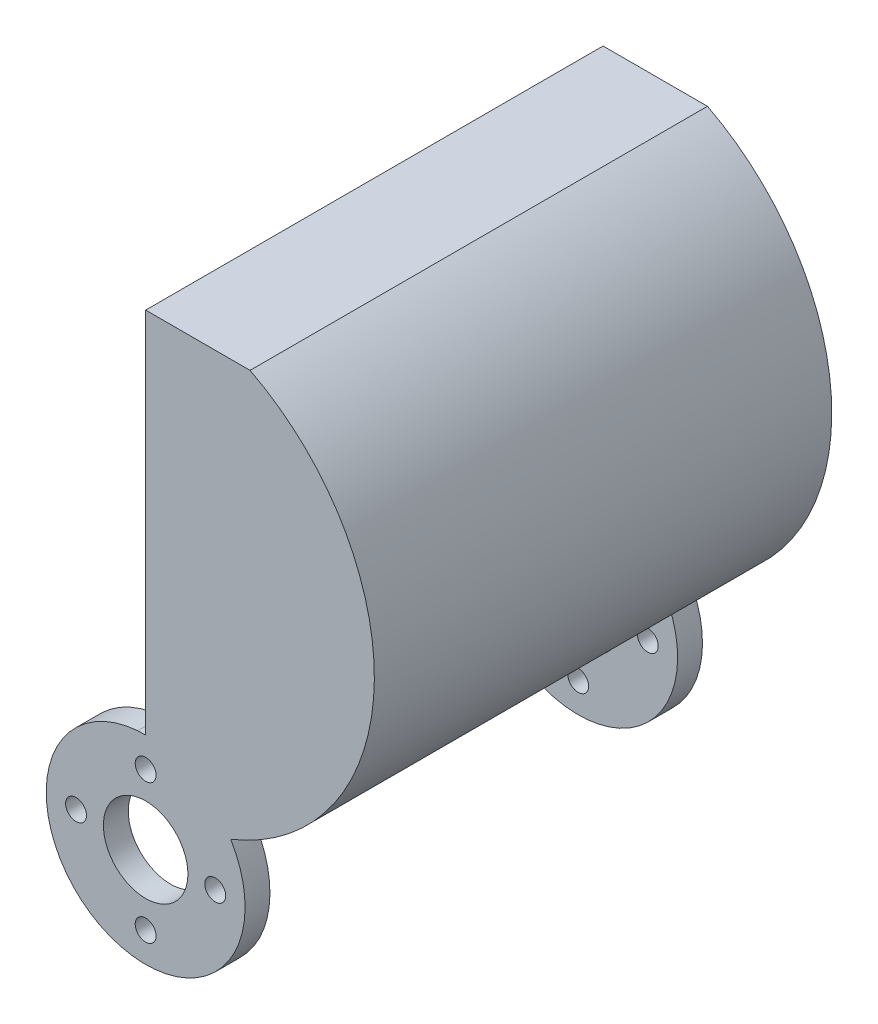
ISO-10303-21;
HEADER;
FILE_DESCRIPTION(('STEP AP214'),'2;1');
FILE_NAME('part.step','',(''),(''),'','','');
FILE_SCHEMA(('AUTOMOTIVE_DESIGN { 1 0 10303 214 1 1 1 1 }'));
ENDSEC;
DATA;
#1=APPLICATION_CONTEXT('core data for automotive mechanical design processes');
#2=APPLICATION_PROTOCOL_DEFINITION('international standard','automotive_design',2000,#1);
#3=PRODUCT_CONTEXT('',#1,'mechanical');
#4=PRODUCT('Part','Part','',(#3));
#5=PRODUCT_RELATED_PRODUCT_CATEGORY('part','',(#4));
#6=PRODUCT_DEFINITION_FORMATION('','',#4);
#7=PRODUCT_DEFINITION_CONTEXT('part definition',#1,'design');
#8=PRODUCT_DEFINITION('design','',#6,#7);
#9=PRODUCT_DEFINITION_SHAPE('','',#8);
#10=(LENGTH_UNIT() NAMED_UNIT(*) SI_UNIT(.MILLI.,.METRE.));
#11=(NAMED_UNIT(*) PLANE_ANGLE_UNIT() SI_UNIT($,.RADIAN.));
#12=(NAMED_UNIT(*) SI_UNIT($,.STERADIAN.) SOLID_ANGLE_UNIT());
#13=UNCERTAINTY_MEASURE_WITH_UNIT(LENGTH_MEASURE(1.E-05),#10,'distance_accuracy_value','');
#14=(GEOMETRIC_REPRESENTATION_CONTEXT(3) GLOBAL_UNCERTAINTY_ASSIGNED_CONTEXT((#13)) GLOBAL_UNIT_ASSIGNED_CONTEXT((#10,
#11,#12)) REPRESENTATION_CONTEXT('',''));
#15=CARTESIAN_POINT('',(0.,0.,0.));
#16=DIRECTION('',(0.,0.,1.));
#17=DIRECTION('',(1.,0.,0.));
#18=AXIS2_PLACEMENT_3D('',#15,#16,#17);
#19=CARTESIAN_POINT('',(0.,9.96810773800832,23.));
#20=DIRECTION('',(0.,1.,0.));
#21=DIRECTION('',(0.,0.,1.));
#22=AXIS2_PLACEMENT_3D('',#19,#20,#21);
#23=PLANE('',#22);
#24=DIRECTION('',(0.,0.,1.));
#25=VECTOR('',#24,1.);
#26=CARTESIAN_POINT('',(0.,9.96810773800832,21.));
#27=LINE('',#26,#25);
#28=CARTESIAN_POINT('',(0.,9.96810773800832,21.));
#29=VERTEX_POINT('',#28);
#30=CARTESIAN_POINT('',(0.,9.96810773800832,23.));
#31=VERTEX_POINT('',#30);
#32=EDGE_CURVE('E301',#29,#31,#27,.T.);
#33=ORIENTED_EDGE('',*,*,#32,.F.);
#34=DIRECTION('',(0.,0.,1.));
#35=VECTOR('',#34,1.);
#36=CARTESIAN_POINT('',(0.,9.96810773800832,-43.3824429441779));
#37=LINE('',#36,#35);
#38=CARTESIAN_POINT('',(0.,9.96810773800832,20.5));
#39=VERTEX_POINT('',#38);
#40=EDGE_CURVE('E205',#39,#29,#37,.T.);
#41=ORIENTED_EDGE('',*,*,#40,.F.);
#42=DIRECTION('',(1.,0.,0.));
#43=VECTOR('',#42,1.);
#44=CARTESIAN_POINT('',(-10.5,9.96810773800832,20.5));
#45=LINE('',#44,#43);
#46=CARTESIAN_POINT('',(-0.798015114805853,9.96810773800832,20.5));
#47=VERTEX_POINT('',#46);
#48=EDGE_CURVE('E229',#47,#39,#45,.T.);
#49=ORIENTED_EDGE('',*,*,#48,.F.);
#50=DIRECTION('',(0.,0.,-1.));
#51=VECTOR('',#50,1.);
#52=CARTESIAN_POINT('',(-0.798015114805841,9.96810773800832,23.));
#53=LINE('',#52,#51);
#54=CARTESIAN_POINT('',(-0.798015114805841,9.96810773800832,23.));
#55=VERTEX_POINT('',#54);
#56=EDGE_CURVE('E375',#55,#47,#53,.T.);
#57=ORIENTED_EDGE('',*,*,#56,.F.);
#58=DIRECTION('',(1.,0.,0.));
#59=VECTOR('',#58,1.);
#60=CARTESIAN_POINT('',(0.,9.96810773800832,23.));
#61=LINE('',#60,#59);
#62=EDGE_CURVE('E323',#55,#31,#61,.T.);
#63=ORIENTED_EDGE('',*,*,#62,.T.);
#64=EDGE_LOOP('',(#33,#41,#49,#57,#63));
#65=FACE_BOUND('',#64,.T.);
#66=ADVANCED_FACE('F45',(#65),#23,.T.);
#67=DIRECTION('',(-1.,0.,0.));
#68=VECTOR('',#67,1.);
#69=CARTESIAN_POINT('',(-10.5,9.96810773800832,-20.5));
#70=LINE('',#69,#68);
#71=CARTESIAN_POINT('',(0.,9.96810773800832,-20.5));
#72=VERTEX_POINT('',#71);
#73=CARTESIAN_POINT('',(-0.798015114805853,9.96810773800832,-20.5));
#74=VERTEX_POINT('',#73);
#75=EDGE_CURVE('E238',#72,#74,#70,.T.);
#76=ORIENTED_EDGE('',*,*,#75,.F.);
#77=CARTESIAN_POINT('',(0.,9.96810773800832,-21.));
#78=VERTEX_POINT('',#77);
#79=EDGE_CURVE('E188',#78,#72,#37,.T.);
#80=ORIENTED_EDGE('',*,*,#79,.F.);
#81=DIRECTION('',(0.,0.,-1.));
#82=VECTOR('',#81,1.);
#83=CARTESIAN_POINT('',(0.,9.96810773800832,-21.));
#84=LINE('',#83,#82);
#85=CARTESIAN_POINT('',(0.,9.96810773800832,-23.));
#86=VERTEX_POINT('',#85);
#87=EDGE_CURVE('E286',#78,#86,#84,.T.);
#88=ORIENTED_EDGE('',*,*,#87,.T.);
#89=DIRECTION('',(1.,0.,0.));
#90=VECTOR('',#89,1.);
#91=CARTESIAN_POINT('',(0.,9.96810773800832,-23.));
#92=LINE('',#91,#90);
#93=CARTESIAN_POINT('',(-0.798015114805841,9.96810773800832,-23.));
#94=VERTEX_POINT('',#93);
#95=EDGE_CURVE('E348',#94,#86,#92,.T.);
#96=ORIENTED_EDGE('',*,*,#95,.F.);
#97=EDGE_CURVE('E374',#74,#94,#53,.T.);
#98=ORIENTED_EDGE('',*,*,#97,.F.);
#99=EDGE_LOOP('',(#76,#80,#88,#96,#98));
#100=FACE_BOUND('',#99,.T.);
#101=ADVANCED_FACE('F446',(#100),#23,.T.);
#102=CARTESIAN_POINT('',(0.,26.5366180703189,23.));
#103=DIRECTION('',(0.,0.,-1.));
#104=DIRECTION('',(-1.,0.,0.));
#105=AXIS2_PLACEMENT_3D('',#102,#103,#104);
#106=CYLINDRICAL_SURFACE('',#105,23.);
#107=CARTESIAN_POINT('',(0.,26.5366180703189,21.));
#108=DIRECTION('',(0.,0.,-1.));
#109=DIRECTION('',(-1.,0.,0.));
#110=AXIS2_PLACEMENT_3D('',#107,#108,#109);
#111=CIRCLE('',#110,23.);
#112=CARTESIAN_POINT('',(16.7904658565913,10.8178313385561,21.));
#113=VERTEX_POINT('',#112);
#114=CARTESIAN_POINT('',(8.55069208344234,5.18513885003635,21.));
#115=VERTEX_POINT('',#114);
#116=EDGE_CURVE('E207',#113,#115,#111,.T.);
#117=ORIENTED_EDGE('',*,*,#116,.F.);
#118=DIRECTION('',(0.,0.,1.));
#119=VECTOR('',#118,1.);
#120=CARTESIAN_POINT('',(16.7904658565913,10.8178313385561,-43.3824429441779));
#121=LINE('',#120,#119);
#122=CARTESIAN_POINT('',(16.7904658565913,10.8178313385561,-21.));
#123=VERTEX_POINT('',#122);
#124=EDGE_CURVE('E210',#123,#113,#121,.T.);
#125=ORIENTED_EDGE('',*,*,#124,.F.);
#126=CARTESIAN_POINT('',(0.,26.5366180703189,-21.));
#127=DIRECTION('',(0.,0.,-1.));
#128=DIRECTION('',(-1.,0.,0.));
#129=AXIS2_PLACEMENT_3D('',#126,#127,#128);
#130=CIRCLE('',#129,23.);
#131=CARTESIAN_POINT('',(8.55069208344234,5.18513885003635,-21.));
#132=VERTEX_POINT('',#131);
#133=EDGE_CURVE('E187',#123,#132,#130,.T.);
#134=ORIENTED_EDGE('',*,*,#133,.T.);
#135=DIRECTION('',(0.,0.,-1.));
#136=VECTOR('',#135,1.);
#137=CARTESIAN_POINT('',(8.55069208344234,5.18513885003635,23.));
#138=LINE('',#137,#136);
#139=CARTESIAN_POINT('',(8.55069208344234,5.18513885003635,-23.));
#140=VERTEX_POINT('',#139);
#141=EDGE_CURVE('E370',#132,#140,#138,.T.);
#142=ORIENTED_EDGE('',*,*,#141,.T.);
#143=CARTESIAN_POINT('',(0.,26.5366180703189,-23.));
#144=DIRECTION('',(0.,0.,1.));
#145=DIRECTION('',(1.,0.,0.));
#146=AXIS2_PLACEMENT_3D('',#143,#144,#145);
#147=CIRCLE('',#146,23.);
#148=CARTESIAN_POINT('',(10.5,47.,-23.));
#149=VERTEX_POINT('',#148);
#150=EDGE_CURVE('E354',#140,#149,#147,.T.);
#151=ORIENTED_EDGE('',*,*,#150,.T.);
#152=DIRECTION('',(0.,0.,-1.));
#153=VECTOR('',#152,1.);
#154=CARTESIAN_POINT('',(10.5,47.,23.));
#155=LINE('',#154,#153);
#156=CARTESIAN_POINT('',(10.5,47.,23.));
#157=VERTEX_POINT('',#156);
#158=EDGE_CURVE('E368',#157,#149,#155,.T.);
#159=ORIENTED_EDGE('',*,*,#158,.F.);
#160=CARTESIAN_POINT('',(0.,26.5366180703189,23.));
#161=DIRECTION('',(0.,0.,1.));
#162=DIRECTION('',(1.,0.,0.));
#163=AXIS2_PLACEMENT_3D('',#160,#161,#162);
#164=CIRCLE('',#163,23.);
#165=CARTESIAN_POINT('',(8.55069208344234,5.18513885003635,23.));
#166=VERTEX_POINT('',#165);
#167=EDGE_CURVE('E328',#166,#157,#164,.T.);
#168=ORIENTED_EDGE('',*,*,#167,.F.);
#169=EDGE_CURVE('E371',#166,#115,#138,.T.);
#170=ORIENTED_EDGE('',*,*,#169,.T.);
#171=EDGE_LOOP('',(#117,#125,#134,#142,#151,#159,#168,#170));
#172=FACE_BOUND('',#171,.T.);
#173=ADVANCED_FACE('F452',(#172),#106,.T.);
#174=CARTESIAN_POINT('',(-10.5,-10.,-20.5));
#175=DIRECTION('',(0.,0.,-1.));
#176=DIRECTION('',(-1.,0.,0.));
#177=AXIS2_PLACEMENT_3D('',#174,#175,#176);
#178=PLANE('',#177);
#179=CARTESIAN_POINT('',(0.,0.,-20.5));
#180=DIRECTION('',(0.,0.,-1.));
#181=DIRECTION('',(-1.,0.,0.));
#182=AXIS2_PLACEMENT_3D('',#179,#180,#181);
#183=CIRCLE('',#182,4.25);
#184=CARTESIAN_POINT('',(-4.25,0.,-20.5));
#185=VERTEX_POINT('',#184);
#186=EDGE_CURVE('E256',#185,#185,#183,.T.);
#187=ORIENTED_EDGE('',*,*,#186,.T.);
#188=EDGE_LOOP('',(#187));
#189=FACE_BOUND('',#188,.T.);
#190=CARTESIAN_POINT('',(0.,7.,-20.5));
#191=DIRECTION('',(0.,0.,-1.));
#192=DIRECTION('',(-1.,0.,0.));
#193=AXIS2_PLACEMENT_3D('',#190,#191,#192);
#194=CIRCLE('',#193,1.05);
#195=CARTESIAN_POINT('',(-1.05,7.,-20.5));
#196=VERTEX_POINT('',#195);
#197=EDGE_CURVE('E257',#196,#196,#194,.T.);
#198=ORIENTED_EDGE('',*,*,#197,.T.);
#199=EDGE_LOOP('',(#198));
#200=FACE_BOUND('',#199,.T.);
#201=CARTESIAN_POINT('',(7.,0.,-20.5));
#202=DIRECTION('',(0.,0.,-1.));
#203=DIRECTION('',(-1.,0.,0.));
#204=AXIS2_PLACEMENT_3D('',#201,#202,#203);
#205=CIRCLE('',#204,1.05);
#206=CARTESIAN_POINT('',(5.95,0.,-20.5));
#207=VERTEX_POINT('',#206);
#208=EDGE_CURVE('E260',#207,#207,#205,.T.);
#209=ORIENTED_EDGE('',*,*,#208,.T.);
#210=EDGE_LOOP('',(#209));
#211=FACE_BOUND('',#210,.T.);
#212=CARTESIAN_POINT('',(0.,-7.,-20.5));
#213=DIRECTION('',(0.,0.,-1.));
#214=DIRECTION('',(-1.,0.,0.));
#215=AXIS2_PLACEMENT_3D('',#212,#213,#214);
#216=CIRCLE('',#215,1.05);
#217=CARTESIAN_POINT('',(-1.05000000000005,-7.,-20.5));
#218=VERTEX_POINT('',#217);
#219=EDGE_CURVE('E263',#218,#218,#216,.T.);
#220=ORIENTED_EDGE('',*,*,#219,.T.);
#221=EDGE_LOOP('',(#220));
#222=FACE_BOUND('',#221,.T.);
#223=CARTESIAN_POINT('',(-7.,0.,-20.5));
#224=DIRECTION('',(0.,0.,-1.));
#225=DIRECTION('',(-1.,0.,0.));
#226=AXIS2_PLACEMENT_3D('',#223,#224,#225);
#227=CIRCLE('',#226,1.05);
#228=CARTESIAN_POINT('',(-8.05,0.,-20.5));
#229=VERTEX_POINT('',#228);
#230=EDGE_CURVE('E266',#229,#229,#227,.T.);
#231=ORIENTED_EDGE('',*,*,#230,.T.);
#232=EDGE_LOOP('',(#231));
#233=FACE_BOUND('',#232,.T.);
#234=CARTESIAN_POINT('',(0.,26.5366180703189,-20.5));
#235=DIRECTION('',(0.,0.,-1.));
#236=DIRECTION('',(-1.,0.,0.));
#237=AXIS2_PLACEMENT_3D('',#234,#235,#236);
#238=CIRCLE('',#237,23.);
#239=CARTESIAN_POINT('',(8.52066877828026,5.17313980551284,-20.5));
#240=VERTEX_POINT('',#239);
#241=CARTESIAN_POINT('',(8.55069208344235,5.18513885003635,-20.5));
#242=VERTEX_POINT('',#241);
#243=EDGE_CURVE('E215',#240,#242,#238,.F.);
#244=ORIENTED_EDGE('',*,*,#243,.F.);
#245=CARTESIAN_POINT('',(0.,0.,-20.5));
#246=DIRECTION('',(0.,0.,-1.));
#247=DIRECTION('',(-1.,0.,0.));
#248=AXIS2_PLACEMENT_3D('',#245,#246,#247);
#249=CIRCLE('',#248,9.96810773800832);
#250=EDGE_CURVE('E198',#72,#240,#249,.T.);
#251=ORIENTED_EDGE('',*,*,#250,.F.);
#252=ORIENTED_EDGE('',*,*,#75,.T.);
#253=CARTESIAN_POINT('',(0.,0.,-20.5));
#254=DIRECTION('',(0.,0.,-1.));
#255=DIRECTION('',(-1.,0.,0.));
#256=AXIS2_PLACEMENT_3D('',#253,#254,#255);
#257=CIRCLE('',#256,10.);
#258=EDGE_CURVE('E269',#242,#74,#257,.T.);
#259=ORIENTED_EDGE('',*,*,#258,.F.);
#260=EDGE_LOOP('',(#244,#251,#252,#259));
#261=FACE_BOUND('',#260,.T.);
#262=ADVANCED_FACE('F440',(#189,#200,#211,#222,#233,#261),#178,.F.);
#263=CARTESIAN_POINT('',(-10.5,-10.,20.5));
#264=DIRECTION('',(0.,0.,1.));
#265=DIRECTION('',(1.,0.,0.));
#266=AXIS2_PLACEMENT_3D('',#263,#264,#265);
#267=PLANE('',#266);
#268=CARTESIAN_POINT('',(0.,0.,20.5));
#269=DIRECTION('',(0.,0.,1.));
#270=DIRECTION('',(1.,0.,0.));
#271=AXIS2_PLACEMENT_3D('',#268,#269,#270);
#272=CIRCLE('',#271,4.25);
#273=CARTESIAN_POINT('',(4.25,0.,20.5));
#274=VERTEX_POINT('',#273);
#275=EDGE_CURVE('E240',#274,#274,#272,.T.);
#276=ORIENTED_EDGE('',*,*,#275,.T.);
#277=EDGE_LOOP('',(#276));
#278=FACE_BOUND('',#277,.T.);
#279=CARTESIAN_POINT('',(0.,7.,20.5));
#280=DIRECTION('',(0.,0.,1.));
#281=DIRECTION('',(1.,0.,0.));
#282=AXIS2_PLACEMENT_3D('',#279,#280,#281);
#283=CIRCLE('',#282,1.05);
#284=CARTESIAN_POINT('',(1.05,7.,20.5));
#285=VERTEX_POINT('',#284);
#286=EDGE_CURVE('E241',#285,#285,#283,.T.);
#287=ORIENTED_EDGE('',*,*,#286,.T.);
#288=EDGE_LOOP('',(#287));
#289=FACE_BOUND('',#288,.T.);
#290=CARTESIAN_POINT('',(7.,0.,20.5));
#291=DIRECTION('',(0.,0.,1.));
#292=DIRECTION('',(1.,0.,0.));
#293=AXIS2_PLACEMENT_3D('',#290,#291,#292);
#294=CIRCLE('',#293,1.05);
#295=CARTESIAN_POINT('',(8.05,0.,20.5));
#296=VERTEX_POINT('',#295);
#297=EDGE_CURVE('E244',#296,#296,#294,.T.);
#298=ORIENTED_EDGE('',*,*,#297,.T.);
#299=EDGE_LOOP('',(#298));
#300=FACE_BOUND('',#299,.T.);
#301=CARTESIAN_POINT('',(0.,-7.,20.5));
#302=DIRECTION('',(0.,0.,1.));
#303=DIRECTION('',(1.,0.,0.));
#304=AXIS2_PLACEMENT_3D('',#301,#302,#303);
#305=CIRCLE('',#304,1.05);
#306=CARTESIAN_POINT('',(1.04999999999995,-7.,20.5));
#307=VERTEX_POINT('',#306);
#308=EDGE_CURVE('E247',#307,#307,#305,.T.);
#309=ORIENTED_EDGE('',*,*,#308,.T.);
#310=EDGE_LOOP('',(#309));
#311=FACE_BOUND('',#310,.T.);
#312=CARTESIAN_POINT('',(-7.,0.,20.5));
#313=DIRECTION('',(0.,0.,1.));
#314=DIRECTION('',(1.,0.,0.));
#315=AXIS2_PLACEMENT_3D('',#312,#313,#314);
#316=CIRCLE('',#315,1.05);
#317=CARTESIAN_POINT('',(-5.95,0.,20.5));
#318=VERTEX_POINT('',#317);
#319=EDGE_CURVE('E250',#318,#318,#316,.T.);
#320=ORIENTED_EDGE('',*,*,#319,.T.);
#321=EDGE_LOOP('',(#320));
#322=FACE_BOUND('',#321,.T.);
#323=CARTESIAN_POINT('',(0.,26.5366180703189,20.5));
#324=DIRECTION('',(0.,0.,1.));
#325=DIRECTION('',(1.,0.,0.));
#326=AXIS2_PLACEMENT_3D('',#323,#324,#325);
#327=CIRCLE('',#326,23.);
#328=CARTESIAN_POINT('',(8.55069208344235,5.18513885003635,20.5));
#329=VERTEX_POINT('',#328);
#330=CARTESIAN_POINT('',(8.52066877828026,5.17313980551284,20.5));
#331=VERTEX_POINT('',#330);
#332=EDGE_CURVE('E11',#329,#331,#327,.F.);
#333=ORIENTED_EDGE('',*,*,#332,.F.);
#334=CARTESIAN_POINT('',(0.,0.,20.5));
#335=DIRECTION('',(0.,0.,1.));
#336=DIRECTION('',(1.,0.,0.));
#337=AXIS2_PLACEMENT_3D('',#334,#335,#336);
#338=CIRCLE('',#337,10.);
#339=EDGE_CURVE('E253',#47,#329,#338,.T.);
#340=ORIENTED_EDGE('',*,*,#339,.F.);
#341=ORIENTED_EDGE('',*,*,#48,.T.);
#342=CARTESIAN_POINT('',(0.,0.,20.5));
#343=DIRECTION('',(0.,0.,1.));
#344=DIRECTION('',(1.,0.,0.));
#345=AXIS2_PLACEMENT_3D('',#342,#343,#344);
#346=CIRCLE('',#345,9.96810773800832);
#347=EDGE_CURVE('E53',#331,#39,#346,.T.);
#348=ORIENTED_EDGE('',*,*,#347,.F.);
#349=EDGE_LOOP('',(#333,#340,#341,#348));
#350=FACE_BOUND('',#349,.T.);
#351=ADVANCED_FACE('F389',(#278,#289,#300,#311,#322,#350),#267,.F.);
#352=CARTESIAN_POINT('',(0.,26.5366180703189,23.));
#353=DIRECTION('',(0.,0.,-1.));
#354=DIRECTION('',(-1.,0.,0.));
#355=AXIS2_PLACEMENT_3D('',#352,#353,#354);
#356=CYLINDRICAL_SURFACE('',#355,20.);
#357=CARTESIAN_POINT('',(0.,26.5366180703189,-21.));
#358=DIRECTION('',(0.,0.,1.));
#359=DIRECTION('',(1.,0.,0.));
#360=AXIS2_PLACEMENT_3D('',#357,#358,#359);
#361=CIRCLE('',#360,20.);
#362=CARTESIAN_POINT('',(16.7157015666161,15.5554832867081,-21.));
#363=VERTEX_POINT('',#362);
#364=CARTESIAN_POINT('',(7.6878818746599,45.,-21.));
#365=VERTEX_POINT('',#364);
#366=EDGE_CURVE('E281',#363,#365,#361,.T.);
#367=ORIENTED_EDGE('',*,*,#366,.F.);
#368=DIRECTION('',(0.,0.,-1.));
#369=VECTOR('',#368,1.);
#370=CARTESIAN_POINT('',(16.7157015666161,15.5554832867081,40.2690459987435));
#371=LINE('',#370,#369);
#372=CARTESIAN_POINT('',(16.7157015666161,15.5554832867081,21.));
#373=VERTEX_POINT('',#372);
#374=EDGE_CURVE('E67',#373,#363,#371,.T.);
#375=ORIENTED_EDGE('',*,*,#374,.F.);
#376=CARTESIAN_POINT('',(0.,26.5366180703189,21.));
#377=DIRECTION('',(0.,0.,1.));
#378=DIRECTION('',(1.,0.,0.));
#379=AXIS2_PLACEMENT_3D('',#376,#377,#378);
#380=CIRCLE('',#379,20.);
#381=CARTESIAN_POINT('',(7.6878818746599,45.,21.));
#382=VERTEX_POINT('',#381);
#383=EDGE_CURVE('E294',#373,#382,#380,.T.);
#384=ORIENTED_EDGE('',*,*,#383,.T.);
#385=DIRECTION('',(0.,0.,-1.));
#386=VECTOR('',#385,1.);
#387=CARTESIAN_POINT('',(7.6878818746599,45.,23.));
#388=LINE('',#387,#386);
#389=EDGE_CURVE('E333',#382,#365,#388,.T.);
#390=ORIENTED_EDGE('',*,*,#389,.T.);
#391=EDGE_LOOP('',(#367,#375,#384,#390));
#392=FACE_BOUND('',#391,.T.);
#393=ADVANCED_FACE('F430',(#392),#356,.F.);
#394=CARTESIAN_POINT('',(0.,26.5366180703189,21.));
#395=DIRECTION('',(0.,0.,1.));
#396=DIRECTION('',(1.,0.,0.));
#397=AXIS2_PLACEMENT_3D('',#394,#395,#396);
#398=PLANE('',#397);
#399=CARTESIAN_POINT('',(0.,0.,21.));
#400=DIRECTION('',(0.,0.,1.));
#401=DIRECTION('',(1.,0.,0.));
#402=AXIS2_PLACEMENT_3D('',#399,#400,#401);
#403=CIRCLE('',#402,22.8339164215697);
#404=CARTESIAN_POINT('',(0.,22.8339164215697,21.));
#405=VERTEX_POINT('',#404);
#406=EDGE_CURVE('E221',#373,#405,#403,.T.);
#407=ORIENTED_EDGE('',*,*,#406,.T.);
#408=DIRECTION('',(0.,-1.,0.));
#409=VECTOR('',#408,1.);
#410=CARTESIAN_POINT('',(0.,47.,21.));
#411=LINE('',#410,#409);
#412=CARTESIAN_POINT('',(0.,47.,21.));
#413=VERTEX_POINT('',#412);
#414=EDGE_CURVE('E291',#413,#405,#411,.T.);
#415=ORIENTED_EDGE('',*,*,#414,.F.);
#416=DIRECTION('',(-0.866025403784438,0.500000000000001,0.));
#417=VECTOR('',#416,1.);
#418=CARTESIAN_POINT('',(0.,47.,21.));
#419=LINE('',#418,#417);
#420=CARTESIAN_POINT('',(3.46410161513775,45.,21.));
#421=VERTEX_POINT('',#420);
#422=EDGE_CURVE('E299',#421,#413,#419,.T.);
#423=ORIENTED_EDGE('',*,*,#422,.F.);
#424=DIRECTION('',(-1.,0.,0.));
#425=VECTOR('',#424,1.);
#426=CARTESIAN_POINT('',(3.46410161513775,45.,21.));
#427=LINE('',#426,#425);
#428=EDGE_CURVE('E297',#382,#421,#427,.T.);
#429=ORIENTED_EDGE('',*,*,#428,.F.);
#430=ORIENTED_EDGE('',*,*,#383,.F.);
#431=EDGE_LOOP('',(#407,#415,#423,#429,#430));
#432=FACE_BOUND('',#431,.T.);
#433=ADVANCED_FACE('F414',(#432),#398,.F.);
#434=CARTESIAN_POINT('',(0.,0.,21.));
#435=DIRECTION('',(0.,0.,1.));
#436=DIRECTION('',(1.,0.,0.));
#437=AXIS2_PLACEMENT_3D('',#434,#435,#436);
#438=CIRCLE('',#437,19.9736130570011);
#439=CARTESIAN_POINT('',(0.,19.9736130570011,21.));
#440=VERTEX_POINT('',#439);
#441=EDGE_CURVE('E227',#440,#113,#438,.F.);
#442=ORIENTED_EDGE('',*,*,#441,.T.);
#443=ORIENTED_EDGE('',*,*,#116,.T.);
#444=CARTESIAN_POINT('',(8.52066877828026,5.17313980551284,21.));
#445=VERTEX_POINT('',#444);
#446=EDGE_CURVE('E213',#115,#445,#111,.T.);
#447=ORIENTED_EDGE('',*,*,#446,.T.);
#448=CARTESIAN_POINT('',(0.,0.,21.));
#449=DIRECTION('',(0.,0.,1.));
#450=DIRECTION('',(-1.,0.,0.));
#451=AXIS2_PLACEMENT_3D('',#448,#449,#450);
#452=CIRCLE('',#451,9.96810773800832);
#453=EDGE_CURVE('E202',#445,#29,#452,.T.);
#454=ORIENTED_EDGE('',*,*,#453,.T.);
#455=EDGE_CURVE('E295',#440,#29,#411,.T.);
#456=ORIENTED_EDGE('',*,*,#455,.F.);
#457=EDGE_LOOP('',(#442,#443,#447,#454,#456));
#458=FACE_BOUND('',#457,.T.);
#459=ADVANCED_FACE('F437',(#458),#398,.F.);
#460=CARTESIAN_POINT('',(0.,26.5366180703189,-21.));
#461=DIRECTION('',(0.,0.,-1.));
#462=DIRECTION('',(1.,0.,0.));
#463=AXIS2_PLACEMENT_3D('',#460,#461,#462);
#464=PLANE('',#463);
#465=CARTESIAN_POINT('',(0.,0.,-21.));
#466=DIRECTION('',(0.,0.,1.));
#467=DIRECTION('',(1.,0.,0.));
#468=AXIS2_PLACEMENT_3D('',#465,#466,#467);
#469=CIRCLE('',#468,22.8339164215697);
#470=CARTESIAN_POINT('',(0.,22.8339164215697,-21.));
#471=VERTEX_POINT('',#470);
#472=EDGE_CURVE('E223',#363,#471,#469,.T.);
#473=ORIENTED_EDGE('',*,*,#472,.F.);
#474=ORIENTED_EDGE('',*,*,#366,.T.);
#475=DIRECTION('',(-1.,0.,0.));
#476=VECTOR('',#475,1.);
#477=CARTESIAN_POINT('',(3.46410161513775,45.,-21.));
#478=LINE('',#477,#476);
#479=CARTESIAN_POINT('',(3.46410161513775,45.,-21.));
#480=VERTEX_POINT('',#479);
#481=EDGE_CURVE('E278',#365,#480,#478,.T.);
#482=ORIENTED_EDGE('',*,*,#481,.T.);
#483=DIRECTION('',(-0.866025403784438,0.500000000000001,0.));
#484=VECTOR('',#483,1.);
#485=CARTESIAN_POINT('',(0.,47.,-21.));
#486=LINE('',#485,#484);
#487=CARTESIAN_POINT('',(0.,47.,-21.));
#488=VERTEX_POINT('',#487);
#489=EDGE_CURVE('E275',#480,#488,#486,.T.);
#490=ORIENTED_EDGE('',*,*,#489,.T.);
#491=DIRECTION('',(0.,-1.,0.));
#492=VECTOR('',#491,1.);
#493=CARTESIAN_POINT('',(0.,47.,-21.));
#494=LINE('',#493,#492);
#495=EDGE_CURVE('E273',#488,#471,#494,.T.);
#496=ORIENTED_EDGE('',*,*,#495,.T.);
#497=EDGE_LOOP('',(#473,#474,#482,#490,#496));
#498=FACE_BOUND('',#497,.T.);
#499=ADVANCED_FACE('F422',(#498),#464,.F.);
#500=ORIENTED_EDGE('',*,*,#133,.F.);
#501=CARTESIAN_POINT('',(0.,0.,-21.));
#502=DIRECTION('',(0.,0.,-1.));
#503=DIRECTION('',(1.,0.,0.));
#504=AXIS2_PLACEMENT_3D('',#501,#502,#503);
#505=CIRCLE('',#504,19.9736130570011);
#506=CARTESIAN_POINT('',(0.,19.9736130570011,-21.));
#507=VERTEX_POINT('',#506);
#508=EDGE_CURVE('E219',#507,#123,#505,.T.);
#509=ORIENTED_EDGE('',*,*,#508,.F.);
#510=EDGE_CURVE('E194',#507,#78,#494,.T.);
#511=ORIENTED_EDGE('',*,*,#510,.T.);
#512=CARTESIAN_POINT('',(0.,0.,-21.));
#513=DIRECTION('',(0.,0.,-1.));
#514=DIRECTION('',(-1.,0.,0.));
#515=AXIS2_PLACEMENT_3D('',#512,#513,#514);
#516=CIRCLE('',#515,9.96810773800832);
#517=CARTESIAN_POINT('',(8.52066877828026,5.17313980551284,-21.));
#518=VERTEX_POINT('',#517);
#519=EDGE_CURVE('E191',#518,#78,#516,.F.);
#520=ORIENTED_EDGE('',*,*,#519,.F.);
#521=EDGE_CURVE('E176',#132,#518,#130,.T.);
#522=ORIENTED_EDGE('',*,*,#521,.F.);
#523=EDGE_LOOP('',(#500,#509,#511,#520,#522));
#524=FACE_BOUND('',#523,.T.);
#525=ADVANCED_FACE('F192',(#524),#464,.F.);
#526=CARTESIAN_POINT('',(0.,0.,23.));
#527=DIRECTION('',(0.,0.,-1.));
#528=DIRECTION('',(-1.,0.,0.));
#529=AXIS2_PLACEMENT_3D('',#526,#527,#528);
#530=CYLINDRICAL_SURFACE('',#529,10.);
#531=ORIENTED_EDGE('',*,*,#56,.T.);
#532=ORIENTED_EDGE('',*,*,#339,.T.);
#533=DIRECTION('',(0.,0.,1.));
#534=VECTOR('',#533,1.);
#535=CARTESIAN_POINT('',(8.55069208344235,5.18513885003635,0.));
#536=LINE('',#535,#534);
#537=EDGE_CURVE('E217',#115,#329,#536,.F.);
#538=ORIENTED_EDGE('',*,*,#537,.F.);
#539=ORIENTED_EDGE('',*,*,#169,.F.);
#540=CARTESIAN_POINT('',(0.,0.,23.));
#541=DIRECTION('',(0.,0.,1.));
#542=DIRECTION('',(1.,0.,0.));
#543=AXIS2_PLACEMENT_3D('',#540,#541,#542);
#544=CIRCLE('',#543,10.);
#545=EDGE_CURVE('E325',#55,#166,#544,.T.);
#546=ORIENTED_EDGE('',*,*,#545,.F.);
#547=EDGE_LOOP('',(#531,#532,#538,#539,#546));
#548=FACE_BOUND('',#547,.T.);
#549=ADVANCED_FACE('F392',(#548),#530,.T.);
#550=CARTESIAN_POINT('',(-7.,0.,23.));
#551=DIRECTION('',(0.,0.,-1.));
#552=DIRECTION('',(-1.,0.,0.));
#553=AXIS2_PLACEMENT_3D('',#550,#551,#552);
#554=CYLINDRICAL_SURFACE('',#553,1.05);
#555=ORIENTED_EDGE('',*,*,#230,.F.);
#556=EDGE_LOOP('',(#555));
#557=FACE_BOUND('',#556,.T.);
#558=CARTESIAN_POINT('',(-7.,0.,-23.));
#559=DIRECTION('',(0.,0.,1.));
#560=DIRECTION('',(1.,0.,0.));
#561=AXIS2_PLACEMENT_3D('',#558,#559,#560);
#562=CIRCLE('',#561,1.05);
#563=CARTESIAN_POINT('',(-5.95,0.,-23.));
#564=VERTEX_POINT('',#563);
#565=EDGE_CURVE('E345',#564,#564,#562,.T.);
#566=ORIENTED_EDGE('',*,*,#565,.F.);
#567=EDGE_LOOP('',(#566));
#568=FACE_BOUND('',#567,.T.);
#569=ADVANCED_FACE('F463',(#557,#568),#554,.F.);
#570=CARTESIAN_POINT('',(0.,-7.,23.));
#571=DIRECTION('',(0.,0.,-1.));
#572=DIRECTION('',(-1.,0.,0.));
#573=AXIS2_PLACEMENT_3D('',#570,#571,#572);
#574=CYLINDRICAL_SURFACE('',#573,1.05);
#575=ORIENTED_EDGE('',*,*,#219,.F.);
#576=EDGE_LOOP('',(#575));
#577=FACE_BOUND('',#576,.T.);
#578=CARTESIAN_POINT('',(0.,-7.,-23.));
#579=DIRECTION('',(0.,0.,1.));
#580=DIRECTION('',(1.,0.,0.));
#581=AXIS2_PLACEMENT_3D('',#578,#579,#580);
#582=CIRCLE('',#581,1.05);
#583=CARTESIAN_POINT('',(1.04999999999995,-7.,-23.));
#584=VERTEX_POINT('',#583);
#585=EDGE_CURVE('E342',#584,#584,#582,.T.);
#586=ORIENTED_EDGE('',*,*,#585,.F.);
#587=EDGE_LOOP('',(#586));
#588=FACE_BOUND('',#587,.T.);
#589=ADVANCED_FACE('F468',(#577,#588),#574,.F.);
#590=CARTESIAN_POINT('',(7.,0.,23.));
#591=DIRECTION('',(0.,0.,-1.));
#592=DIRECTION('',(-1.,0.,0.));
#593=AXIS2_PLACEMENT_3D('',#590,#591,#592);
#594=CYLINDRICAL_SURFACE('',#593,1.05);
#595=ORIENTED_EDGE('',*,*,#208,.F.);
#596=EDGE_LOOP('',(#595));
#597=FACE_BOUND('',#596,.T.);
#598=CARTESIAN_POINT('',(7.,0.,-23.));
#599=DIRECTION('',(0.,0.,1.));
#600=DIRECTION('',(1.,0.,0.));
#601=AXIS2_PLACEMENT_3D('',#598,#599,#600);
#602=CIRCLE('',#601,1.05);
#603=CARTESIAN_POINT('',(8.05,0.,-23.));
#604=VERTEX_POINT('',#603);
#605=EDGE_CURVE('E339',#604,#604,#602,.T.);
#606=ORIENTED_EDGE('',*,*,#605,.F.);
#607=EDGE_LOOP('',(#606));
#608=FACE_BOUND('',#607,.T.);
#609=ADVANCED_FACE('F472',(#597,#608),#594,.F.);
#610=CARTESIAN_POINT('',(0.,7.,23.));
#611=DIRECTION('',(0.,0.,-1.));
#612=DIRECTION('',(-1.,0.,0.));
#613=AXIS2_PLACEMENT_3D('',#610,#611,#612);
#614=CYLINDRICAL_SURFACE('',#613,1.05);
#615=ORIENTED_EDGE('',*,*,#197,.F.);
#616=EDGE_LOOP('',(#615));
#617=FACE_BOUND('',#616,.T.);
#618=CARTESIAN_POINT('',(0.,7.,-23.));
#619=DIRECTION('',(0.,0.,1.));
#620=DIRECTION('',(1.,0.,0.));
#621=AXIS2_PLACEMENT_3D('',#618,#619,#620);
#622=CIRCLE('',#621,1.05);
#623=CARTESIAN_POINT('',(1.05,7.,-23.));
#624=VERTEX_POINT('',#623);
#625=EDGE_CURVE('E336',#624,#624,#622,.T.);
#626=ORIENTED_EDGE('',*,*,#625,.F.);
#627=EDGE_LOOP('',(#626));
#628=FACE_BOUND('',#627,.T.);
#629=ADVANCED_FACE('F475',(#617,#628),#614,.F.);
#630=CARTESIAN_POINT('',(0.,0.,23.));
#631=DIRECTION('',(0.,0.,-1.));
#632=DIRECTION('',(-1.,0.,0.));
#633=AXIS2_PLACEMENT_3D('',#630,#631,#632);
#634=CYLINDRICAL_SURFACE('',#633,4.25);
#635=ORIENTED_EDGE('',*,*,#186,.F.);
#636=EDGE_LOOP('',(#635));
#637=FACE_BOUND('',#636,.T.);
#638=CARTESIAN_POINT('',(0.,0.,-23.));
#639=DIRECTION('',(0.,0.,1.));
#640=DIRECTION('',(1.,0.,0.));
#641=AXIS2_PLACEMENT_3D('',#638,#639,#640);
#642=CIRCLE('',#641,4.25);
#643=CARTESIAN_POINT('',(4.25,0.,-23.));
#644=VERTEX_POINT('',#643);
#645=EDGE_CURVE('E306',#644,#644,#642,.T.);
#646=ORIENTED_EDGE('',*,*,#645,.F.);
#647=EDGE_LOOP('',(#646));
#648=FACE_BOUND('',#647,.T.);
#649=ADVANCED_FACE('F479',(#637,#648),#634,.F.);
#650=CARTESIAN_POINT('',(20.3515969889343,35.25,23.));
#651=DIRECTION('',(0.500000000000001,0.866025403784438,0.));
#652=DIRECTION('',(-0.866025403784438,0.500000000000001,0.));
#653=AXIS2_PLACEMENT_3D('',#650,#651,#652);
#654=PLANE('',#653);
#655=ORIENTED_EDGE('',*,*,#489,.F.);
#656=DIRECTION('',(0.,0.,-1.));
#657=VECTOR('',#656,1.);
#658=CARTESIAN_POINT('',(3.46410161513775,45.,23.));
#659=LINE('',#658,#657);
#660=EDGE_CURVE('E361',#421,#480,#659,.T.);
#661=ORIENTED_EDGE('',*,*,#660,.F.);
#662=ORIENTED_EDGE('',*,*,#422,.T.);
#663=DIRECTION('',(0.,0.,-1.));
#664=VECTOR('',#663,1.);
#665=CARTESIAN_POINT('',(0.,47.,23.));
#666=LINE('',#665,#664);
#667=EDGE_CURVE('E364',#413,#488,#666,.T.);
#668=ORIENTED_EDGE('',*,*,#667,.T.);
#669=EDGE_LOOP('',(#655,#661,#662,#668));
#670=FACE_BOUND('',#669,.T.);
#671=ADVANCED_FACE('F426',(#670),#654,.F.);
#672=CARTESIAN_POINT('',(0.,45.,23.));
#673=DIRECTION('',(0.,1.,0.));
#674=DIRECTION('',(-1.,0.,0.));
#675=AXIS2_PLACEMENT_3D('',#672,#673,#674);
#676=PLANE('',#675);
#677=ORIENTED_EDGE('',*,*,#481,.F.);
#678=ORIENTED_EDGE('',*,*,#389,.F.);
#679=ORIENTED_EDGE('',*,*,#428,.T.);
#680=ORIENTED_EDGE('',*,*,#660,.T.);
#681=EDGE_LOOP('',(#677,#678,#679,#680));
#682=FACE_BOUND('',#681,.T.);
#683=ADVANCED_FACE('F428',(#682),#676,.F.);
#684=EDGE_CURVE('E183',#242,#132,#138,.T.);
#685=ORIENTED_EDGE('',*,*,#684,.F.);
#686=ORIENTED_EDGE('',*,*,#258,.T.);
#687=ORIENTED_EDGE('',*,*,#97,.T.);
#688=CARTESIAN_POINT('',(0.,0.,-23.));
#689=DIRECTION('',(0.,0.,1.));
#690=DIRECTION('',(1.,0.,0.));
#691=AXIS2_PLACEMENT_3D('',#688,#689,#690);
#692=CIRCLE('',#691,10.);
#693=EDGE_CURVE('E351',#94,#140,#692,.T.);
#694=ORIENTED_EDGE('',*,*,#693,.T.);
#695=ORIENTED_EDGE('',*,*,#141,.F.);
#696=EDGE_LOOP('',(#685,#686,#687,#694,#695));
#697=FACE_BOUND('',#696,.T.);
#698=ADVANCED_FACE('F456',(#697),#530,.T.);
#699=CARTESIAN_POINT('',(0.,47.,23.));
#700=DIRECTION('',(0.,1.,0.));
#701=DIRECTION('',(0.,0.,1.));
#702=AXIS2_PLACEMENT_3D('',#699,#700,#701);
#703=PLANE('',#702);
#704=DIRECTION('',(1.,0.,0.));
#705=VECTOR('',#704,1.);
#706=CARTESIAN_POINT('',(0.,47.,-23.));
#707=LINE('',#706,#705);
#708=CARTESIAN_POINT('',(0.,47.,-23.));
#709=VERTEX_POINT('',#708);
#710=EDGE_CURVE('E311',#709,#149,#707,.T.);
#711=ORIENTED_EDGE('',*,*,#710,.F.);
#712=DIRECTION('',(0.,0.,-1.));
#713=VECTOR('',#712,1.);
#714=CARTESIAN_POINT('',(0.,47.,-21.));
#715=LINE('',#714,#713);
#716=EDGE_CURVE('E283',#488,#709,#715,.T.);
#717=ORIENTED_EDGE('',*,*,#716,.F.);
#718=ORIENTED_EDGE('',*,*,#667,.F.);
#719=CARTESIAN_POINT('',(0.,47.,23.));
#720=VERTEX_POINT('',#719);
#721=EDGE_CURVE('E365',#720,#413,#666,.T.);
#722=ORIENTED_EDGE('',*,*,#721,.F.);
#723=DIRECTION('',(1.,0.,0.));
#724=VECTOR('',#723,1.);
#725=CARTESIAN_POINT('',(0.,47.,23.));
#726=LINE('',#725,#724);
#727=EDGE_CURVE('E330',#720,#157,#726,.T.);
#728=ORIENTED_EDGE('',*,*,#727,.T.);
#729=ORIENTED_EDGE('',*,*,#158,.T.);
#730=EDGE_LOOP('',(#711,#717,#718,#722,#728,#729));
#731=FACE_BOUND('',#730,.T.);
#732=ADVANCED_FACE('F407',(#731),#703,.T.);
#733=ORIENTED_EDGE('',*,*,#319,.F.);
#734=EDGE_LOOP('',(#733));
#735=FACE_BOUND('',#734,.T.);
#736=CARTESIAN_POINT('',(-7.,0.,23.));
#737=DIRECTION('',(0.,0.,1.));
#738=DIRECTION('',(1.,0.,0.));
#739=AXIS2_PLACEMENT_3D('',#736,#737,#738);
#740=CIRCLE('',#739,1.05);
#741=CARTESIAN_POINT('',(-5.95,0.,23.));
#742=VERTEX_POINT('',#741);
#743=EDGE_CURVE('E320',#742,#742,#740,.T.);
#744=ORIENTED_EDGE('',*,*,#743,.T.);
#745=EDGE_LOOP('',(#744));
#746=FACE_BOUND('',#745,.T.);
#747=ADVANCED_FACE('F458',(#735,#746),#554,.F.);
#748=ORIENTED_EDGE('',*,*,#308,.F.);
#749=EDGE_LOOP('',(#748));
#750=FACE_BOUND('',#749,.T.);
#751=CARTESIAN_POINT('',(0.,-7.,23.));
#752=DIRECTION('',(0.,0.,1.));
#753=DIRECTION('',(1.,0.,0.));
#754=AXIS2_PLACEMENT_3D('',#751,#752,#753);
#755=CIRCLE('',#754,1.05);
#756=CARTESIAN_POINT('',(1.04999999999995,-7.,23.));
#757=VERTEX_POINT('',#756);
#758=EDGE_CURVE('E317',#757,#757,#755,.T.);
#759=ORIENTED_EDGE('',*,*,#758,.T.);
#760=EDGE_LOOP('',(#759));
#761=FACE_BOUND('',#760,.T.);
#762=ADVANCED_FACE('F461',(#750,#761),#574,.F.);
#763=ORIENTED_EDGE('',*,*,#297,.F.);
#764=EDGE_LOOP('',(#763));
#765=FACE_BOUND('',#764,.T.);
#766=CARTESIAN_POINT('',(7.,0.,23.));
#767=DIRECTION('',(0.,0.,1.));
#768=DIRECTION('',(1.,0.,0.));
#769=AXIS2_PLACEMENT_3D('',#766,#767,#768);
#770=CIRCLE('',#769,1.05);
#771=CARTESIAN_POINT('',(8.05,0.,23.));
#772=VERTEX_POINT('',#771);
#773=EDGE_CURVE('E314',#772,#772,#770,.T.);
#774=ORIENTED_EDGE('',*,*,#773,.T.);
#775=EDGE_LOOP('',(#774));
#776=FACE_BOUND('',#775,.T.);
#777=ADVANCED_FACE('F466',(#765,#776),#594,.F.);
#778=ORIENTED_EDGE('',*,*,#286,.F.);
#779=EDGE_LOOP('',(#778));
#780=FACE_BOUND('',#779,.T.);
#781=CARTESIAN_POINT('',(0.,7.,23.));
#782=DIRECTION('',(0.,0.,1.));
#783=DIRECTION('',(1.,0.,0.));
#784=AXIS2_PLACEMENT_3D('',#781,#782,#783);
#785=CIRCLE('',#784,1.05);
#786=CARTESIAN_POINT('',(1.05,7.,23.));
#787=VERTEX_POINT('',#786);
#788=EDGE_CURVE('E310',#787,#787,#785,.T.);
#789=ORIENTED_EDGE('',*,*,#788,.T.);
#790=EDGE_LOOP('',(#789));
#791=FACE_BOUND('',#790,.T.);
#792=ADVANCED_FACE('F470',(#780,#791),#614,.F.);
#793=ORIENTED_EDGE('',*,*,#275,.F.);
#794=EDGE_LOOP('',(#793));
#795=FACE_BOUND('',#794,.T.);
#796=CARTESIAN_POINT('',(0.,0.,23.));
#797=DIRECTION('',(0.,0.,1.));
#798=DIRECTION('',(1.,0.,0.));
#799=AXIS2_PLACEMENT_3D('',#796,#797,#798);
#800=CIRCLE('',#799,4.25);
#801=CARTESIAN_POINT('',(4.25,0.,23.));
#802=VERTEX_POINT('',#801);
#803=EDGE_CURVE('E307',#802,#802,#800,.T.);
#804=ORIENTED_EDGE('',*,*,#803,.T.);
#805=EDGE_LOOP('',(#804));
#806=FACE_BOUND('',#805,.T.);
#807=ADVANCED_FACE('F47',(#795,#806),#634,.F.);
#808=CARTESIAN_POINT('',(0.,0.,23.));
#809=DIRECTION('',(0.,0.,1.));
#810=DIRECTION('',(1.,0.,0.));
#811=AXIS2_PLACEMENT_3D('',#808,#809,#810);
#812=PLANE('',#811);
#813=ORIENTED_EDGE('',*,*,#727,.F.);
#814=DIRECTION('',(0.,-1.,0.));
#815=VECTOR('',#814,1.);
#816=CARTESIAN_POINT('',(0.,47.,23.));
#817=LINE('',#816,#815);
#818=EDGE_CURVE('E288',#720,#31,#817,.T.);
#819=ORIENTED_EDGE('',*,*,#818,.T.);
#820=ORIENTED_EDGE('',*,*,#62,.F.);
#821=ORIENTED_EDGE('',*,*,#545,.T.);
#822=ORIENTED_EDGE('',*,*,#167,.T.);
#823=EDGE_LOOP('',(#813,#819,#820,#821,#822));
#824=FACE_BOUND('',#823,.T.);
#825=ORIENTED_EDGE('',*,*,#803,.F.);
#826=EDGE_LOOP('',(#825));
#827=FACE_BOUND('',#826,.T.);
#828=ORIENTED_EDGE('',*,*,#788,.F.);
#829=EDGE_LOOP('',(#828));
#830=FACE_BOUND('',#829,.T.);
#831=ORIENTED_EDGE('',*,*,#773,.F.);
#832=EDGE_LOOP('',(#831));
#833=FACE_BOUND('',#832,.T.);
#834=ORIENTED_EDGE('',*,*,#758,.F.);
#835=EDGE_LOOP('',(#834));
#836=FACE_BOUND('',#835,.T.);
#837=ORIENTED_EDGE('',*,*,#743,.F.);
#838=EDGE_LOOP('',(#837));
#839=FACE_BOUND('',#838,.T.);
#840=ADVANCED_FACE('F403',(#824,#827,#830,#833,#836,#839),#812,.T.);
#841=CARTESIAN_POINT('',(0.,0.,-23.));
#842=DIRECTION('',(0.,0.,1.));
#843=DIRECTION('',(1.,0.,0.));
#844=AXIS2_PLACEMENT_3D('',#841,#842,#843);
#845=PLANE('',#844);
#846=ORIENTED_EDGE('',*,*,#95,.T.);
#847=DIRECTION('',(0.,-1.,0.));
#848=VECTOR('',#847,1.);
#849=CARTESIAN_POINT('',(0.,47.,-23.));
#850=LINE('',#849,#848);
#851=EDGE_CURVE('E272',#709,#86,#850,.T.);
#852=ORIENTED_EDGE('',*,*,#851,.F.);
#853=ORIENTED_EDGE('',*,*,#710,.T.);
#854=ORIENTED_EDGE('',*,*,#150,.F.);
#855=ORIENTED_EDGE('',*,*,#693,.F.);
#856=EDGE_LOOP('',(#846,#852,#853,#854,#855));
#857=FACE_BOUND('',#856,.T.);
#858=ORIENTED_EDGE('',*,*,#645,.T.);
#859=EDGE_LOOP('',(#858));
#860=FACE_BOUND('',#859,.T.);
#861=ORIENTED_EDGE('',*,*,#625,.T.);
#862=EDGE_LOOP('',(#861));
#863=FACE_BOUND('',#862,.T.);
#864=ORIENTED_EDGE('',*,*,#605,.T.);
#865=EDGE_LOOP('',(#864));
#866=FACE_BOUND('',#865,.T.);
#867=ORIENTED_EDGE('',*,*,#585,.T.);
#868=EDGE_LOOP('',(#867));
#869=FACE_BOUND('',#868,.T.);
#870=ORIENTED_EDGE('',*,*,#565,.T.);
#871=EDGE_LOOP('',(#870));
#872=FACE_BOUND('',#871,.T.);
#873=ADVANCED_FACE('F494',(#857,#860,#863,#866,#869,#872),#845,.F.);
#874=CARTESIAN_POINT('',(0.,47.,21.));
#875=DIRECTION('',(-1.,0.,0.));
#876=DIRECTION('',(0.,-1.,0.));
#877=AXIS2_PLACEMENT_3D('',#874,#875,#876);
#878=PLANE('',#877);
#879=ORIENTED_EDGE('',*,*,#818,.F.);
#880=ORIENTED_EDGE('',*,*,#721,.T.);
#881=ORIENTED_EDGE('',*,*,#414,.T.);
#882=DIRECTION('',(0.,0.,-1.));
#883=VECTOR('',#882,1.);
#884=CARTESIAN_POINT('',(0.,22.8339164215697,40.2690459987435));
#885=LINE('',#884,#883);
#886=EDGE_CURVE('E226',#405,#471,#885,.T.);
#887=ORIENTED_EDGE('',*,*,#886,.T.);
#888=ORIENTED_EDGE('',*,*,#495,.F.);
#889=ORIENTED_EDGE('',*,*,#716,.T.);
#890=ORIENTED_EDGE('',*,*,#851,.T.);
#891=ORIENTED_EDGE('',*,*,#87,.F.);
#892=ORIENTED_EDGE('',*,*,#510,.F.);
#893=DIRECTION('',(0.,0.,-1.));
#894=VECTOR('',#893,1.);
#895=CARTESIAN_POINT('',(0.,19.9736130570011,40.2690459987435));
#896=LINE('',#895,#894);
#897=EDGE_CURVE('E222',#440,#507,#896,.T.);
#898=ORIENTED_EDGE('',*,*,#897,.F.);
#899=ORIENTED_EDGE('',*,*,#455,.T.);
#900=ORIENTED_EDGE('',*,*,#32,.T.);
#901=EDGE_LOOP('',(#879,#880,#881,#887,#888,#889,#890,#891,#892,#898,#899,#900));
#902=FACE_BOUND('',#901,.T.);
#903=ADVANCED_FACE('F400',(#902),#878,.T.);
#904=CARTESIAN_POINT('',(0.,0.,40.2690459987435));
#905=DIRECTION('',(0.,0.,-1.));
#906=DIRECTION('',(-1.,0.,0.));
#907=AXIS2_PLACEMENT_3D('',#904,#905,#906);
#908=CYLINDRICAL_SURFACE('',#907,22.8339164215697);
#909=ORIENTED_EDGE('',*,*,#406,.F.);
#910=ORIENTED_EDGE('',*,*,#374,.T.);
#911=ORIENTED_EDGE('',*,*,#472,.T.);
#912=ORIENTED_EDGE('',*,*,#886,.F.);
#913=EDGE_LOOP('',(#909,#910,#911,#912));
#914=FACE_BOUND('',#913,.T.);
#915=ADVANCED_FACE('F418',(#914),#908,.T.);
#916=CARTESIAN_POINT('',(0.,0.,40.2690459987435));
#917=DIRECTION('',(0.,0.,-1.));
#918=DIRECTION('',(-1.,0.,0.));
#919=AXIS2_PLACEMENT_3D('',#916,#917,#918);
#920=CYLINDRICAL_SURFACE('',#919,19.9736130570011);
#921=ORIENTED_EDGE('',*,*,#441,.F.);
#922=ORIENTED_EDGE('',*,*,#897,.T.);
#923=ORIENTED_EDGE('',*,*,#508,.T.);
#924=ORIENTED_EDGE('',*,*,#124,.T.);
#925=EDGE_LOOP('',(#921,#922,#923,#924));
#926=FACE_BOUND('',#925,.T.);
#927=ADVANCED_FACE('F531',(#926),#920,.F.);
#928=CARTESIAN_POINT('',(0.,26.5366180703189,-43.3824429441779));
#929=DIRECTION('',(0.,0.,1.));
#930=DIRECTION('',(1.,0.,0.));
#931=AXIS2_PLACEMENT_3D('',#928,#929,#930);
#932=CYLINDRICAL_SURFACE('',#931,23.);
#933=ORIENTED_EDGE('',*,*,#537,.T.);
#934=ORIENTED_EDGE('',*,*,#332,.T.);
#935=DIRECTION('',(0.,0.,1.));
#936=VECTOR('',#935,1.);
#937=CARTESIAN_POINT('',(8.52066877828026,5.17313980551284,-43.3824429441779));
#938=LINE('',#937,#936);
#939=EDGE_CURVE('E60',#331,#445,#938,.T.);
#940=ORIENTED_EDGE('',*,*,#939,.T.);
#941=ORIENTED_EDGE('',*,*,#446,.F.);
#942=EDGE_LOOP('',(#933,#934,#940,#941));
#943=FACE_BOUND('',#942,.T.);
#944=ADVANCED_FACE('F537',(#943),#932,.F.);
#945=ORIENTED_EDGE('',*,*,#684,.T.);
#946=ORIENTED_EDGE('',*,*,#521,.T.);
#947=EDGE_CURVE('E180',#518,#240,#938,.T.);
#948=ORIENTED_EDGE('',*,*,#947,.T.);
#949=ORIENTED_EDGE('',*,*,#243,.T.);
#950=EDGE_LOOP('',(#945,#946,#948,#949));
#951=FACE_BOUND('',#950,.T.);
#952=ADVANCED_FACE('F178',(#951),#932,.F.);
#953=CARTESIAN_POINT('',(0.,0.,-43.3824429441779));
#954=DIRECTION('',(0.,0.,1.));
#955=DIRECTION('',(1.,0.,0.));
#956=AXIS2_PLACEMENT_3D('',#953,#954,#955);
#957=CYLINDRICAL_SURFACE('',#956,9.96810773800832);
#958=ORIENTED_EDGE('',*,*,#250,.T.);
#959=ORIENTED_EDGE('',*,*,#947,.F.);
#960=ORIENTED_EDGE('',*,*,#519,.T.);
#961=ORIENTED_EDGE('',*,*,#79,.T.);
#962=EDGE_LOOP('',(#958,#959,#960,#961));
#963=FACE_BOUND('',#962,.T.);
#964=ADVANCED_FACE('F200',(#963),#957,.T.);
#965=ORIENTED_EDGE('',*,*,#347,.T.);
#966=ORIENTED_EDGE('',*,*,#40,.T.);
#967=ORIENTED_EDGE('',*,*,#453,.F.);
#968=ORIENTED_EDGE('',*,*,#939,.F.);
#969=EDGE_LOOP('',(#965,#966,#967,#968));
#970=FACE_BOUND('',#969,.T.);
#971=ADVANCED_FACE('F383',(#970),#957,.T.);
#972=CLOSED_SHELL('',(#66,#101,#173,#262,#351,#393,#433,#459,#499,#525,#549,#569,#589,#609,#629,
#649,#671,#683,#698,#732,#747,#762,#777,#792,#807,#840,#873,#903,#915,#927,#944,#952,#964,#971));
#973=MANIFOLD_SOLID_BREP('B2',#972);
#974=ADVANCED_BREP_SHAPE_REPRESENTATION('',(#18,#973),#14);
#975=SHAPE_DEFINITION_REPRESENTATION(#9,#974);
ENDSEC;
END-ISO-10303-21;
